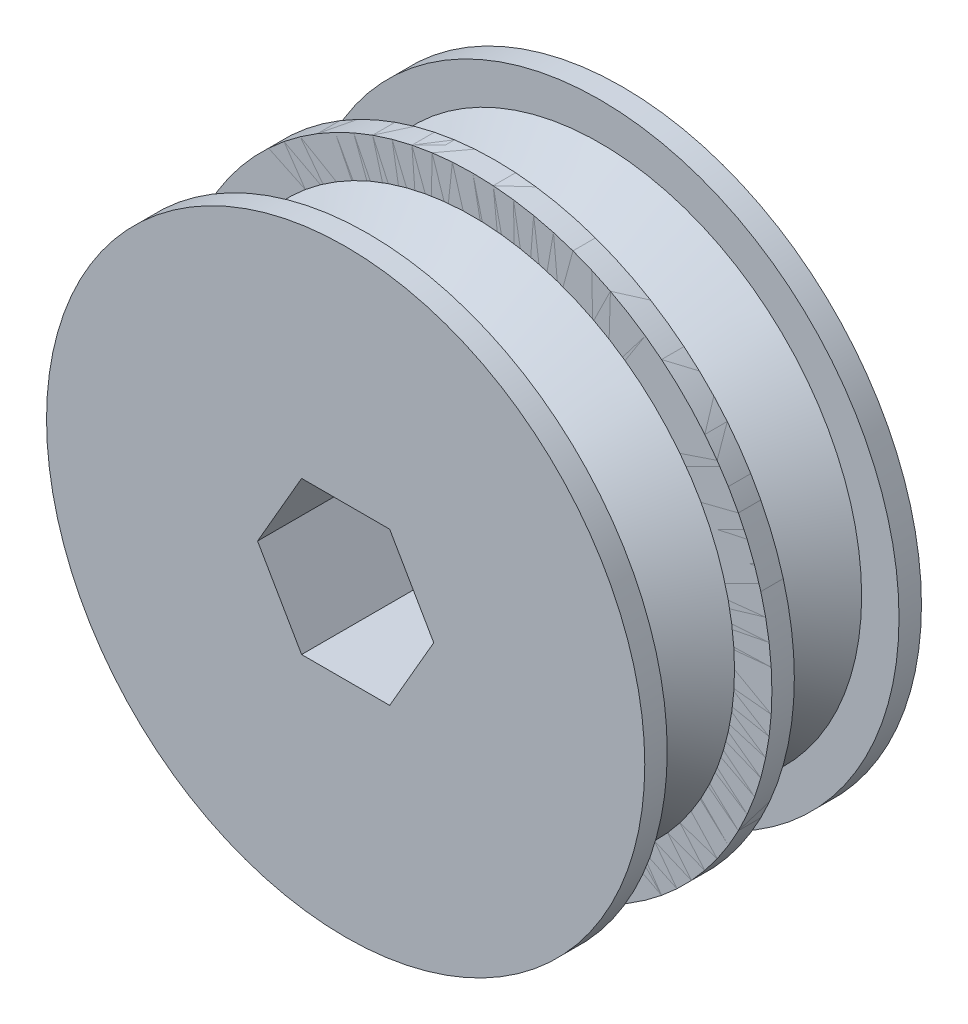
ISO-10303-21;
HEADER;
FILE_DESCRIPTION(('STEP AP214'),'2;1');
FILE_NAME('part.step','',(''),(''),'','','');
FILE_SCHEMA(('AUTOMOTIVE_DESIGN { 1 0 10303 214 1 1 1 1 }'));
ENDSEC;
DATA;
#1=APPLICATION_CONTEXT('core data for automotive mechanical design processes');
#2=APPLICATION_PROTOCOL_DEFINITION('international standard','automotive_design',2000,#1);
#3=PRODUCT_CONTEXT('',#1,'mechanical');
#4=PRODUCT('Part','Part','',(#3));
#5=PRODUCT_RELATED_PRODUCT_CATEGORY('part','',(#4));
#6=PRODUCT_DEFINITION_FORMATION('','',#4);
#7=PRODUCT_DEFINITION_CONTEXT('part definition',#1,'design');
#8=PRODUCT_DEFINITION('design','',#6,#7);
#9=PRODUCT_DEFINITION_SHAPE('','',#8);
#10=(LENGTH_UNIT() NAMED_UNIT(*) SI_UNIT(.MILLI.,.METRE.));
#11=(NAMED_UNIT(*) PLANE_ANGLE_UNIT() SI_UNIT($,.RADIAN.));
#12=(NAMED_UNIT(*) SI_UNIT($,.STERADIAN.) SOLID_ANGLE_UNIT());
#13=UNCERTAINTY_MEASURE_WITH_UNIT(LENGTH_MEASURE(1.E-05),#10,'distance_accuracy_value','');
#14=(GEOMETRIC_REPRESENTATION_CONTEXT(3) GLOBAL_UNCERTAINTY_ASSIGNED_CONTEXT((#13)) GLOBAL_UNIT_ASSIGNED_CONTEXT((#10,
#11,#12)) REPRESENTATION_CONTEXT('',''));
#15=CARTESIAN_POINT('',(0.,0.,0.));
#16=DIRECTION('',(0.,0.,1.));
#17=DIRECTION('',(1.,0.,0.));
#18=AXIS2_PLACEMENT_3D('',#15,#16,#17);
#19=CARTESIAN_POINT('',(0.,0.,6.35));
#20=DIRECTION('',(0.,0.,-1.));
#21=DIRECTION('',(-1.,0.,0.));
#22=AXIS2_PLACEMENT_3D('',#19,#20,#21);
#23=CYLINDRICAL_SURFACE('',#22,25.4);
#24=CARTESIAN_POINT('',(0.,0.,6.35));
#25=DIRECTION('',(0.,0.,1.));
#26=DIRECTION('',(1.,0.,0.));
#27=AXIS2_PLACEMENT_3D('',#24,#25,#26);
#28=CIRCLE('',#27,25.4);
#29=CARTESIAN_POINT('',(25.4,0.,6.35));
#30=VERTEX_POINT('',#29);
#31=EDGE_CURVE('P0_E11',#30,#30,#28,.T.);
#32=ORIENTED_EDGE('',*,*,#31,.F.);
#33=EDGE_LOOP('',(#32));
#34=FACE_BOUND('',#33,.T.);
#35=CARTESIAN_POINT('',(0.,0.,4.445));
#36=DIRECTION('',(0.,0.,1.));
#37=DIRECTION('',(1.,0.,0.));
#38=AXIS2_PLACEMENT_3D('',#35,#36,#37);
#39=CIRCLE('',#38,25.4);
#40=CARTESIAN_POINT('',(25.4,0.,4.445));
#41=VERTEX_POINT('',#40);
#42=EDGE_CURVE('P0_E126',#41,#41,#39,.T.);
#43=ORIENTED_EDGE('',*,*,#42,.T.);
#44=EDGE_LOOP('',(#43));
#45=FACE_BOUND('',#44,.T.);
#46=ADVANCED_FACE('P0_F16',(#34,#45),#23,.T.);
#47=CARTESIAN_POINT('',(0.,0.,6.35));
#48=DIRECTION('',(0.,0.,1.));
#49=DIRECTION('',(1.,0.,0.));
#50=AXIS2_PLACEMENT_3D('',#47,#48,#49);
#51=PLANE('',#50);
#52=DIRECTION('',(-0.499999999999998,0.86602540378444,0.));
#53=VECTOR('',#52,1.);
#54=CARTESIAN_POINT('',(-3.73949769354121,-6.477,6.35));
#55=LINE('',#54,#53);
#56=CARTESIAN_POINT('',(-3.73949769354121,-6.477,6.35));
#57=VERTEX_POINT('',#56);
#58=CARTESIAN_POINT('',(-7.4789953870824,0.,6.35));
#59=VERTEX_POINT('',#58);
#60=EDGE_CURVE('P0_E70',#57,#59,#55,.T.);
#61=ORIENTED_EDGE('',*,*,#60,.T.);
#62=DIRECTION('',(0.499999999999998,0.86602540378444,0.));
#63=VECTOR('',#62,1.);
#64=CARTESIAN_POINT('',(-7.4789953870824,0.,6.35));
#65=LINE('',#64,#63);
#66=CARTESIAN_POINT('',(-3.73949769354121,6.477,6.35));
#67=VERTEX_POINT('',#66);
#68=EDGE_CURVE('P0_E79',#59,#67,#65,.T.);
#69=ORIENTED_EDGE('',*,*,#68,.T.);
#70=DIRECTION('',(1.,0.,0.));
#71=VECTOR('',#70,1.);
#72=CARTESIAN_POINT('',(-3.73949769354122,6.477,6.35));
#73=LINE('',#72,#71);
#74=CARTESIAN_POINT('',(3.73949769354122,6.477,6.35));
#75=VERTEX_POINT('',#74);
#76=EDGE_CURVE('P0_E30',#67,#75,#73,.T.);
#77=ORIENTED_EDGE('',*,*,#76,.T.);
#78=DIRECTION('',(0.499999999999998,-0.86602540378444,0.));
#79=VECTOR('',#78,1.);
#80=CARTESIAN_POINT('',(3.73949769354122,6.477,6.35));
#81=LINE('',#80,#79);
#82=CARTESIAN_POINT('',(7.4789953870824,0.,6.35));
#83=VERTEX_POINT('',#82);
#84=EDGE_CURVE('P0_E94',#75,#83,#81,.T.);
#85=ORIENTED_EDGE('',*,*,#84,.T.);
#86=DIRECTION('',(-0.499999999999998,-0.86602540378444,0.));
#87=VECTOR('',#86,1.);
#88=CARTESIAN_POINT('',(7.4789953870824,0.,6.35));
#89=LINE('',#88,#87);
#90=CARTESIAN_POINT('',(3.73949769354122,-6.477,6.35));
#91=VERTEX_POINT('',#90);
#92=EDGE_CURVE('P0_E97',#83,#91,#89,.T.);
#93=ORIENTED_EDGE('',*,*,#92,.T.);
#94=DIRECTION('',(-1.,0.,0.));
#95=VECTOR('',#94,1.);
#96=CARTESIAN_POINT('',(3.73949769354122,-6.477,6.35));
#97=LINE('',#96,#95);
#98=EDGE_CURVE('P0_E76',#91,#57,#97,.T.);
#99=ORIENTED_EDGE('',*,*,#98,.T.);
#100=EDGE_LOOP('',(#61,#69,#77,#85,#93,#99));
#101=FACE_BOUND('',#100,.T.);
#102=ORIENTED_EDGE('',*,*,#31,.T.);
#103=EDGE_LOOP('',(#102));
#104=FACE_BOUND('',#103,.T.);
#105=ADVANCED_FACE('P0_F83',(#101,#104),#51,.T.);
#106=CARTESIAN_POINT('',(0.,0.,0.));
#107=DIRECTION('',(0.,0.,-1.));
#108=DIRECTION('',(-1.,0.,0.));
#109=AXIS2_PLACEMENT_3D('',#106,#107,#108);
#110=CONICAL_SURFACE('',#109,17.78,0.785398163397449);
#111=CARTESIAN_POINT('',(0.,0.,-4.445));
#112=DIRECTION('',(0.,0.,1.));
#113=DIRECTION('',(1.,0.,0.));
#114=AXIS2_PLACEMENT_3D('',#111,#112,#113);
#115=CIRCLE('',#114,22.225);
#116=CARTESIAN_POINT('',(22.225,0.,-4.445));
#117=VERTEX_POINT('',#116);
#118=EDGE_CURVE('P0_E113',#117,#117,#115,.T.);
#119=ORIENTED_EDGE('',*,*,#118,.T.);
#120=EDGE_LOOP('',(#119));
#121=FACE_BOUND('',#120,.T.);
#122=CARTESIAN_POINT('',(0.,0.,0.));
#123=DIRECTION('',(0.,0.,1.));
#124=DIRECTION('',(1.,0.,0.));
#125=AXIS2_PLACEMENT_3D('',#122,#123,#124);
#126=CIRCLE('',#125,17.78);
#127=CARTESIAN_POINT('',(17.78,0.,0.));
#128=VERTEX_POINT('',#127);
#129=EDGE_CURVE('P0_E132',#128,#128,#126,.T.);
#130=ORIENTED_EDGE('',*,*,#129,.F.);
#131=EDGE_LOOP('',(#130));
#132=FACE_BOUND('',#131,.T.);
#133=ADVANCED_FACE('P0_F160',(#121,#132),#110,.T.);
#134=CARTESIAN_POINT('',(0.,0.,4.445));
#135=DIRECTION('',(0.,0.,1.));
#136=DIRECTION('',(1.,0.,0.));
#137=AXIS2_PLACEMENT_3D('',#134,#135,#136);
#138=CONICAL_SURFACE('',#137,22.225,0.785398163397449);
#139=ORIENTED_EDGE('',*,*,#129,.T.);
#140=EDGE_LOOP('',(#139));
#141=FACE_BOUND('',#140,.T.);
#142=CARTESIAN_POINT('',(0.,0.,4.445));
#143=DIRECTION('',(0.,0.,1.));
#144=DIRECTION('',(1.,0.,0.));
#145=AXIS2_PLACEMENT_3D('',#142,#143,#144);
#146=CIRCLE('',#145,22.225);
#147=CARTESIAN_POINT('',(22.225,0.,4.445));
#148=VERTEX_POINT('',#147);
#149=EDGE_CURVE('P0_E129',#148,#148,#146,.T.);
#150=ORIENTED_EDGE('',*,*,#149,.F.);
#151=EDGE_LOOP('',(#150));
#152=FACE_BOUND('',#151,.T.);
#153=ADVANCED_FACE('P0_F166',(#141,#152),#138,.T.);
#154=CARTESIAN_POINT('',(-22.225,0.,4.445));
#155=DIRECTION('',(0.,0.,-1.));
#156=DIRECTION('',(-1.,0.,0.));
#157=AXIS2_PLACEMENT_3D('',#154,#155,#156);
#158=PLANE('',#157);
#159=ORIENTED_EDGE('',*,*,#149,.T.);
#160=EDGE_LOOP('',(#159));
#161=FACE_BOUND('',#160,.T.);
#162=ORIENTED_EDGE('',*,*,#42,.F.);
#163=EDGE_LOOP('',(#162));
#164=FACE_BOUND('',#163,.T.);
#165=ADVANCED_FACE('P0_F151',(#161,#164),#158,.T.);
#166=CARTESIAN_POINT('',(-22.225,0.,-4.445));
#167=DIRECTION('',(0.,0.,1.));
#168=DIRECTION('',(1.,0.,0.));
#169=AXIS2_PLACEMENT_3D('',#166,#167,#168);
#170=PLANE('',#169);
#171=CARTESIAN_POINT('',(0.,0.,-4.445));
#172=DIRECTION('',(0.,0.,1.));
#173=DIRECTION('',(1.,0.,0.));
#174=AXIS2_PLACEMENT_3D('',#171,#172,#173);
#175=CIRCLE('',#174,25.4);
#176=CARTESIAN_POINT('',(25.4,0.,-4.445));
#177=VERTEX_POINT('',#176);
#178=EDGE_CURVE('P0_E123',#177,#177,#175,.T.);
#179=ORIENTED_EDGE('',*,*,#178,.T.);
#180=EDGE_LOOP('',(#179));
#181=FACE_BOUND('',#180,.T.);
#182=ORIENTED_EDGE('',*,*,#118,.F.);
#183=EDGE_LOOP('',(#182));
#184=FACE_BOUND('',#183,.T.);
#185=ADVANCED_FACE('P0_F144',(#181,#184),#170,.T.);
#186=CARTESIAN_POINT('',(0.,0.,-6.35));
#187=DIRECTION('',(0.,0.,1.));
#188=DIRECTION('',(1.,0.,0.));
#189=AXIS2_PLACEMENT_3D('',#186,#187,#188);
#190=PLANE('',#189);
#191=DIRECTION('',(0.499999999999998,0.86602540378444,0.));
#192=VECTOR('',#191,1.);
#193=CARTESIAN_POINT('',(-7.4789953870824,0.,-6.35));
#194=LINE('',#193,#192);
#195=CARTESIAN_POINT('',(-7.4789953870824,0.,-6.35));
#196=VERTEX_POINT('',#195);
#197=CARTESIAN_POINT('',(-3.73949769354122,6.477,-6.35));
#198=VERTEX_POINT('',#197);
#199=EDGE_CURVE('P0_E101',#196,#198,#194,.T.);
#200=ORIENTED_EDGE('',*,*,#199,.F.);
#201=DIRECTION('',(-0.499999999999998,0.86602540378444,0.));
#202=VECTOR('',#201,1.);
#203=CARTESIAN_POINT('',(-3.73949769354121,-6.477,-6.35));
#204=LINE('',#203,#202);
#205=CARTESIAN_POINT('',(-3.73949769354121,-6.477,-6.35));
#206=VERTEX_POINT('',#205);
#207=EDGE_CURVE('P0_E38',#206,#196,#204,.T.);
#208=ORIENTED_EDGE('',*,*,#207,.F.);
#209=DIRECTION('',(-1.,0.,0.));
#210=VECTOR('',#209,1.);
#211=CARTESIAN_POINT('',(3.73949769354122,-6.477,-6.35));
#212=LINE('',#211,#210);
#213=CARTESIAN_POINT('',(3.73949769354122,-6.477,-6.35));
#214=VERTEX_POINT('',#213);
#215=EDGE_CURVE('P0_E87',#214,#206,#212,.T.);
#216=ORIENTED_EDGE('',*,*,#215,.F.);
#217=DIRECTION('',(-0.499999999999998,-0.86602540378444,0.));
#218=VECTOR('',#217,1.);
#219=CARTESIAN_POINT('',(7.4789953870824,0.,-6.35));
#220=LINE('',#219,#218);
#221=CARTESIAN_POINT('',(7.4789953870824,0.,-6.35));
#222=VERTEX_POINT('',#221);
#223=EDGE_CURVE('P0_E90',#222,#214,#220,.T.);
#224=ORIENTED_EDGE('',*,*,#223,.F.);
#225=DIRECTION('',(0.499999999999998,-0.86602540378444,0.));
#226=VECTOR('',#225,1.);
#227=CARTESIAN_POINT('',(3.73949769354122,6.477,-6.35));
#228=LINE('',#227,#226);
#229=CARTESIAN_POINT('',(3.73949769354122,6.477,-6.35));
#230=VERTEX_POINT('',#229);
#231=EDGE_CURVE('P0_E106',#230,#222,#228,.T.);
#232=ORIENTED_EDGE('',*,*,#231,.F.);
#233=DIRECTION('',(1.,0.,0.));
#234=VECTOR('',#233,1.);
#235=CARTESIAN_POINT('',(-3.73949769354122,6.477,-6.35));
#236=LINE('',#235,#234);
#237=EDGE_CURVE('P0_E103',#198,#230,#236,.T.);
#238=ORIENTED_EDGE('',*,*,#237,.F.);
#239=EDGE_LOOP('',(#200,#208,#216,#224,#232,#238));
#240=FACE_BOUND('',#239,.T.);
#241=CARTESIAN_POINT('',(0.,0.,-6.35));
#242=DIRECTION('',(0.,0.,1.));
#243=DIRECTION('',(1.,0.,0.));
#244=AXIS2_PLACEMENT_3D('',#241,#242,#243);
#245=CIRCLE('',#244,25.4);
#246=CARTESIAN_POINT('',(25.4,0.,-6.35));
#247=VERTEX_POINT('',#246);
#248=EDGE_CURVE('P0_E19',#247,#247,#245,.T.);
#249=ORIENTED_EDGE('',*,*,#248,.F.);
#250=EDGE_LOOP('',(#249));
#251=FACE_BOUND('',#250,.T.);
#252=ADVANCED_FACE('P0_F142',(#240,#251),#190,.F.);
#253=ORIENTED_EDGE('',*,*,#248,.T.);
#254=EDGE_LOOP('',(#253));
#255=FACE_BOUND('',#254,.T.);
#256=ORIENTED_EDGE('',*,*,#178,.F.);
#257=EDGE_LOOP('',(#256));
#258=FACE_BOUND('',#257,.T.);
#259=ADVANCED_FACE('P0_F139',(#255,#258),#23,.T.);
#260=CARTESIAN_POINT('',(-3.73949769354121,-6.477,6.35));
#261=DIRECTION('',(-0.86602540378444,-0.499999999999998,0.));
#262=DIRECTION('',(0.499999999999998,-0.86602540378444,0.));
#263=AXIS2_PLACEMENT_3D('',#260,#261,#262);
#264=PLANE('',#263);
#265=ORIENTED_EDGE('',*,*,#207,.T.);
#266=DIRECTION('',(0.,0.,-1.));
#267=VECTOR('',#266,1.);
#268=CARTESIAN_POINT('',(-7.4789953870824,0.,6.35));
#269=LINE('',#268,#267);
#270=EDGE_CURVE('P0_E66',#59,#196,#269,.T.);
#271=ORIENTED_EDGE('',*,*,#270,.F.);
#272=ORIENTED_EDGE('',*,*,#60,.F.);
#273=DIRECTION('',(0.,0.,-1.));
#274=VECTOR('',#273,1.);
#275=CARTESIAN_POINT('',(-3.73949769354121,-6.477,6.35));
#276=LINE('',#275,#274);
#277=EDGE_CURVE('P0_E111',#57,#206,#276,.T.);
#278=ORIENTED_EDGE('',*,*,#277,.T.);
#279=EDGE_LOOP('',(#265,#271,#272,#278));
#280=FACE_BOUND('',#279,.T.);
#281=ADVANCED_FACE('P0_F68',(#280),#264,.F.);
#282=CARTESIAN_POINT('',(3.73949769354122,-6.477,6.35));
#283=DIRECTION('',(0.,-1.,0.));
#284=DIRECTION('',(0.,0.,-1.));
#285=AXIS2_PLACEMENT_3D('',#282,#283,#284);
#286=PLANE('',#285);
#287=ORIENTED_EDGE('',*,*,#215,.T.);
#288=ORIENTED_EDGE('',*,*,#277,.F.);
#289=ORIENTED_EDGE('',*,*,#98,.F.);
#290=DIRECTION('',(0.,0.,-1.));
#291=VECTOR('',#290,1.);
#292=CARTESIAN_POINT('',(3.73949769354122,-6.477,6.35));
#293=LINE('',#292,#291);
#294=EDGE_CURVE('P0_E114',#91,#214,#293,.T.);
#295=ORIENTED_EDGE('',*,*,#294,.T.);
#296=EDGE_LOOP('',(#287,#288,#289,#295));
#297=FACE_BOUND('',#296,.T.);
#298=ADVANCED_FACE('P0_F226',(#297),#286,.F.);
#299=CARTESIAN_POINT('',(7.4789953870824,0.,6.35));
#300=DIRECTION('',(0.86602540378444,-0.499999999999998,0.));
#301=DIRECTION('',(0.499999999999998,0.86602540378444,0.));
#302=AXIS2_PLACEMENT_3D('',#299,#300,#301);
#303=PLANE('',#302);
#304=ORIENTED_EDGE('',*,*,#223,.T.);
#305=ORIENTED_EDGE('',*,*,#294,.F.);
#306=ORIENTED_EDGE('',*,*,#92,.F.);
#307=DIRECTION('',(0.,0.,-1.));
#308=VECTOR('',#307,1.);
#309=CARTESIAN_POINT('',(7.4789953870824,0.,6.35));
#310=LINE('',#309,#308);
#311=EDGE_CURVE('P0_E116',#83,#222,#310,.T.);
#312=ORIENTED_EDGE('',*,*,#311,.T.);
#313=EDGE_LOOP('',(#304,#305,#306,#312));
#314=FACE_BOUND('',#313,.T.);
#315=ADVANCED_FACE('P0_F234',(#314),#303,.F.);
#316=CARTESIAN_POINT('',(3.73949769354122,6.477,6.35));
#317=DIRECTION('',(0.86602540378444,0.499999999999998,0.));
#318=DIRECTION('',(-0.499999999999998,0.86602540378444,0.));
#319=AXIS2_PLACEMENT_3D('',#316,#317,#318);
#320=PLANE('',#319);
#321=ORIENTED_EDGE('',*,*,#231,.T.);
#322=ORIENTED_EDGE('',*,*,#311,.F.);
#323=ORIENTED_EDGE('',*,*,#84,.F.);
#324=DIRECTION('',(0.,0.,-1.));
#325=VECTOR('',#324,1.);
#326=CARTESIAN_POINT('',(3.73949769354122,6.477,6.35));
#327=LINE('',#326,#325);
#328=EDGE_CURVE('P0_E118',#75,#230,#327,.T.);
#329=ORIENTED_EDGE('',*,*,#328,.T.);
#330=EDGE_LOOP('',(#321,#322,#323,#329));
#331=FACE_BOUND('',#330,.T.);
#332=ADVANCED_FACE('P0_F244',(#331),#320,.F.);
#333=CARTESIAN_POINT('',(-3.73949769354122,6.477,6.35));
#334=DIRECTION('',(0.,1.,0.));
#335=DIRECTION('',(0.,0.,1.));
#336=AXIS2_PLACEMENT_3D('',#333,#334,#335);
#337=PLANE('',#336);
#338=ORIENTED_EDGE('',*,*,#237,.T.);
#339=ORIENTED_EDGE('',*,*,#328,.F.);
#340=ORIENTED_EDGE('',*,*,#76,.F.);
#341=DIRECTION('',(0.,0.,-1.));
#342=VECTOR('',#341,1.);
#343=CARTESIAN_POINT('',(-3.73949769354122,6.477,6.35));
#344=LINE('',#343,#342);
#345=EDGE_CURVE('P0_E75',#67,#198,#344,.T.);
#346=ORIENTED_EDGE('',*,*,#345,.T.);
#347=EDGE_LOOP('',(#338,#339,#340,#346));
#348=FACE_BOUND('',#347,.T.);
#349=ADVANCED_FACE('P0_F254',(#348),#337,.F.);
#350=CARTESIAN_POINT('',(-7.4789953870824,0.,6.35));
#351=DIRECTION('',(-0.86602540378444,0.499999999999998,0.));
#352=DIRECTION('',(-0.499999999999998,-0.86602540378444,0.));
#353=AXIS2_PLACEMENT_3D('',#350,#351,#352);
#354=PLANE('',#353);
#355=ORIENTED_EDGE('',*,*,#199,.T.);
#356=ORIENTED_EDGE('',*,*,#345,.F.);
#357=ORIENTED_EDGE('',*,*,#68,.F.);
#358=ORIENTED_EDGE('',*,*,#270,.T.);
#359=EDGE_LOOP('',(#355,#356,#357,#358));
#360=FACE_BOUND('',#359,.T.);
#361=ADVANCED_FACE('P0_F80',(#360),#354,.F.);
#362=CLOSED_SHELL('',(#46,#105,#133,#153,#165,#185,#252,#259,#281,#298,#315,#332,#349,#361));
#363=MANIFOLD_SOLID_BREP('P0_B1',#362);
#364=CARTESIAN_POINT('',(0.,0.,17.145));
#365=DIRECTION('',(0.,0.,-1.));
#366=DIRECTION('',(-1.,0.,0.));
#367=AXIS2_PLACEMENT_3D('',#364,#365,#366);
#368=CYLINDRICAL_SURFACE('',#367,25.4);
#369=CARTESIAN_POINT('',(0.,0.,17.145));
#370=DIRECTION('',(0.,0.,1.));
#371=DIRECTION('',(1.,0.,0.));
#372=AXIS2_PLACEMENT_3D('',#369,#370,#371);
#373=CIRCLE('',#372,25.4);
#374=CARTESIAN_POINT('',(25.4,0.,17.145));
#375=VERTEX_POINT('',#374);
#376=EDGE_CURVE('P1_E10',#375,#375,#373,.T.);
#377=ORIENTED_EDGE('',*,*,#376,.F.);
#378=EDGE_LOOP('',(#377));
#379=FACE_BOUND('',#378,.T.);
#380=CARTESIAN_POINT('',(0.,0.,15.24));
#381=DIRECTION('',(0.,0.,1.));
#382=DIRECTION('',(1.,0.,0.));
#383=AXIS2_PLACEMENT_3D('',#380,#381,#382);
#384=CIRCLE('',#383,25.4);
#385=CARTESIAN_POINT('',(25.4,0.,15.24));
#386=VERTEX_POINT('',#385);
#387=EDGE_CURVE('P1_E125',#386,#386,#384,.T.);
#388=ORIENTED_EDGE('',*,*,#387,.T.);
#389=EDGE_LOOP('',(#388));
#390=FACE_BOUND('',#389,.T.);
#391=ADVANCED_FACE('P1_F15',(#379,#390),#368,.T.);
#392=CARTESIAN_POINT('',(0.,0.,17.145));
#393=DIRECTION('',(0.,0.,1.));
#394=DIRECTION('',(1.,0.,0.));
#395=AXIS2_PLACEMENT_3D('',#392,#393,#394);
#396=PLANE('',#395);
#397=DIRECTION('',(-0.499999999999998,0.86602540378444,0.));
#398=VECTOR('',#397,1.);
#399=CARTESIAN_POINT('',(-3.73949769354121,-6.477,17.145));
#400=LINE('',#399,#398);
#401=CARTESIAN_POINT('',(-3.73949769354121,-6.477,17.145));
#402=VERTEX_POINT('',#401);
#403=CARTESIAN_POINT('',(-7.4789953870824,0.,17.145));
#404=VERTEX_POINT('',#403);
#405=EDGE_CURVE('P1_E69',#402,#404,#400,.T.);
#406=ORIENTED_EDGE('',*,*,#405,.T.);
#407=DIRECTION('',(0.499999999999998,0.86602540378444,0.));
#408=VECTOR('',#407,1.);
#409=CARTESIAN_POINT('',(-7.4789953870824,0.,17.145));
#410=LINE('',#409,#408);
#411=CARTESIAN_POINT('',(-3.73949769354121,6.477,17.145));
#412=VERTEX_POINT('',#411);
#413=EDGE_CURVE('P1_E78',#404,#412,#410,.T.);
#414=ORIENTED_EDGE('',*,*,#413,.T.);
#415=DIRECTION('',(1.,0.,0.));
#416=VECTOR('',#415,1.);
#417=CARTESIAN_POINT('',(-3.73949769354122,6.477,17.145));
#418=LINE('',#417,#416);
#419=CARTESIAN_POINT('',(3.73949769354122,6.477,17.145));
#420=VERTEX_POINT('',#419);
#421=EDGE_CURVE('P1_E29',#412,#420,#418,.T.);
#422=ORIENTED_EDGE('',*,*,#421,.T.);
#423=DIRECTION('',(0.499999999999998,-0.86602540378444,0.));
#424=VECTOR('',#423,1.);
#425=CARTESIAN_POINT('',(3.73949769354122,6.477,17.145));
#426=LINE('',#425,#424);
#427=CARTESIAN_POINT('',(7.4789953870824,0.,17.145));
#428=VERTEX_POINT('',#427);
#429=EDGE_CURVE('P1_E93',#420,#428,#426,.T.);
#430=ORIENTED_EDGE('',*,*,#429,.T.);
#431=DIRECTION('',(-0.499999999999998,-0.86602540378444,0.));
#432=VECTOR('',#431,1.);
#433=CARTESIAN_POINT('',(7.4789953870824,0.,17.145));
#434=LINE('',#433,#432);
#435=CARTESIAN_POINT('',(3.73949769354122,-6.477,17.145));
#436=VERTEX_POINT('',#435);
#437=EDGE_CURVE('P1_E96',#428,#436,#434,.T.);
#438=ORIENTED_EDGE('',*,*,#437,.T.);
#439=DIRECTION('',(-1.,0.,0.));
#440=VECTOR('',#439,1.);
#441=CARTESIAN_POINT('',(3.73949769354122,-6.477,17.145));
#442=LINE('',#441,#440);
#443=EDGE_CURVE('P1_E75',#436,#402,#442,.T.);
#444=ORIENTED_EDGE('',*,*,#443,.T.);
#445=EDGE_LOOP('',(#406,#414,#422,#430,#438,#444));
#446=FACE_BOUND('',#445,.T.);
#447=ORIENTED_EDGE('',*,*,#376,.T.);
#448=EDGE_LOOP('',(#447));
#449=FACE_BOUND('',#448,.T.);
#450=ADVANCED_FACE('P1_F82',(#446,#449),#396,.T.);
#451=CARTESIAN_POINT('',(0.,0.,10.795));
#452=DIRECTION('',(0.,0.,-1.));
#453=DIRECTION('',(-1.,0.,0.));
#454=AXIS2_PLACEMENT_3D('',#451,#452,#453);
#455=CONICAL_SURFACE('',#454,17.78,0.785398163397449);
#456=CARTESIAN_POINT('',(0.,0.,6.35));
#457=DIRECTION('',(0.,0.,1.));
#458=DIRECTION('',(1.,0.,0.));
#459=AXIS2_PLACEMENT_3D('',#456,#457,#458);
#460=CIRCLE('',#459,22.225);
#461=CARTESIAN_POINT('',(22.225,0.,6.35));
#462=VERTEX_POINT('',#461);
#463=EDGE_CURVE('P1_E112',#462,#462,#460,.T.);
#464=ORIENTED_EDGE('',*,*,#463,.T.);
#465=EDGE_LOOP('',(#464));
#466=FACE_BOUND('',#465,.T.);
#467=CARTESIAN_POINT('',(0.,0.,10.795));
#468=DIRECTION('',(0.,0.,1.));
#469=DIRECTION('',(1.,0.,0.));
#470=AXIS2_PLACEMENT_3D('',#467,#468,#469);
#471=CIRCLE('',#470,17.78);
#472=CARTESIAN_POINT('',(17.78,0.,10.795));
#473=VERTEX_POINT('',#472);
#474=EDGE_CURVE('P1_E131',#473,#473,#471,.T.);
#475=ORIENTED_EDGE('',*,*,#474,.F.);
#476=EDGE_LOOP('',(#475));
#477=FACE_BOUND('',#476,.T.);
#478=ADVANCED_FACE('P1_F159',(#466,#477),#455,.T.);
#479=CARTESIAN_POINT('',(0.,0.,15.24));
#480=DIRECTION('',(0.,0.,1.));
#481=DIRECTION('',(1.,0.,0.));
#482=AXIS2_PLACEMENT_3D('',#479,#480,#481);
#483=CONICAL_SURFACE('',#482,22.225,0.785398163397449);
#484=ORIENTED_EDGE('',*,*,#474,.T.);
#485=EDGE_LOOP('',(#484));
#486=FACE_BOUND('',#485,.T.);
#487=CARTESIAN_POINT('',(0.,0.,15.24));
#488=DIRECTION('',(0.,0.,1.));
#489=DIRECTION('',(1.,0.,0.));
#490=AXIS2_PLACEMENT_3D('',#487,#488,#489);
#491=CIRCLE('',#490,22.225);
#492=CARTESIAN_POINT('',(22.225,0.,15.24));
#493=VERTEX_POINT('',#492);
#494=EDGE_CURVE('P1_E128',#493,#493,#491,.T.);
#495=ORIENTED_EDGE('',*,*,#494,.F.);
#496=EDGE_LOOP('',(#495));
#497=FACE_BOUND('',#496,.T.);
#498=ADVANCED_FACE('P1_F165',(#486,#497),#483,.T.);
#499=CARTESIAN_POINT('',(-22.225,0.,15.24));
#500=DIRECTION('',(0.,0.,-1.));
#501=DIRECTION('',(-1.,0.,0.));
#502=AXIS2_PLACEMENT_3D('',#499,#500,#501);
#503=PLANE('',#502);
#504=ORIENTED_EDGE('',*,*,#494,.T.);
#505=EDGE_LOOP('',(#504));
#506=FACE_BOUND('',#505,.T.);
#507=ORIENTED_EDGE('',*,*,#387,.F.);
#508=EDGE_LOOP('',(#507));
#509=FACE_BOUND('',#508,.T.);
#510=ADVANCED_FACE('P1_F150',(#506,#509),#503,.T.);
#511=CARTESIAN_POINT('',(-22.225,0.,6.35));
#512=DIRECTION('',(0.,0.,1.));
#513=DIRECTION('',(1.,0.,0.));
#514=AXIS2_PLACEMENT_3D('',#511,#512,#513);
#515=PLANE('',#514);
#516=CARTESIAN_POINT('',(0.,0.,6.35));
#517=DIRECTION('',(0.,0.,1.));
#518=DIRECTION('',(1.,0.,0.));
#519=AXIS2_PLACEMENT_3D('',#516,#517,#518);
#520=CIRCLE('',#519,25.4);
#521=CARTESIAN_POINT('',(25.4,0.,6.35));
#522=VERTEX_POINT('',#521);
#523=EDGE_CURVE('P1_E122',#522,#522,#520,.T.);
#524=ORIENTED_EDGE('',*,*,#523,.T.);
#525=EDGE_LOOP('',(#524));
#526=FACE_BOUND('',#525,.T.);
#527=ORIENTED_EDGE('',*,*,#463,.F.);
#528=EDGE_LOOP('',(#527));
#529=FACE_BOUND('',#528,.T.);
#530=ADVANCED_FACE('P1_F143',(#526,#529),#515,.T.);
#531=CARTESIAN_POINT('',(0.,0.,4.445));
#532=DIRECTION('',(0.,0.,1.));
#533=DIRECTION('',(1.,0.,0.));
#534=AXIS2_PLACEMENT_3D('',#531,#532,#533);
#535=PLANE('',#534);
#536=DIRECTION('',(0.499999999999998,0.86602540378444,0.));
#537=VECTOR('',#536,1.);
#538=CARTESIAN_POINT('',(-7.4789953870824,0.,4.445));
#539=LINE('',#538,#537);
#540=CARTESIAN_POINT('',(-7.4789953870824,0.,4.445));
#541=VERTEX_POINT('',#540);
#542=CARTESIAN_POINT('',(-3.73949769354122,6.477,4.445));
#543=VERTEX_POINT('',#542);
#544=EDGE_CURVE('P1_E100',#541,#543,#539,.T.);
#545=ORIENTED_EDGE('',*,*,#544,.F.);
#546=DIRECTION('',(-0.499999999999998,0.86602540378444,0.));
#547=VECTOR('',#546,1.);
#548=CARTESIAN_POINT('',(-3.73949769354121,-6.477,4.445));
#549=LINE('',#548,#547);
#550=CARTESIAN_POINT('',(-3.73949769354121,-6.477,4.445));
#551=VERTEX_POINT('',#550);
#552=EDGE_CURVE('P1_E37',#551,#541,#549,.T.);
#553=ORIENTED_EDGE('',*,*,#552,.F.);
#554=DIRECTION('',(-1.,0.,0.));
#555=VECTOR('',#554,1.);
#556=CARTESIAN_POINT('',(3.73949769354122,-6.477,4.445));
#557=LINE('',#556,#555);
#558=CARTESIAN_POINT('',(3.73949769354122,-6.477,4.445));
#559=VERTEX_POINT('',#558);
#560=EDGE_CURVE('P1_E86',#559,#551,#557,.T.);
#561=ORIENTED_EDGE('',*,*,#560,.F.);
#562=DIRECTION('',(-0.499999999999998,-0.86602540378444,0.));
#563=VECTOR('',#562,1.);
#564=CARTESIAN_POINT('',(7.4789953870824,0.,4.445));
#565=LINE('',#564,#563);
#566=CARTESIAN_POINT('',(7.4789953870824,0.,4.445));
#567=VERTEX_POINT('',#566);
#568=EDGE_CURVE('P1_E89',#567,#559,#565,.T.);
#569=ORIENTED_EDGE('',*,*,#568,.F.);
#570=DIRECTION('',(0.499999999999998,-0.86602540378444,0.));
#571=VECTOR('',#570,1.);
#572=CARTESIAN_POINT('',(3.73949769354122,6.477,4.445));
#573=LINE('',#572,#571);
#574=CARTESIAN_POINT('',(3.73949769354122,6.477,4.445));
#575=VERTEX_POINT('',#574);
#576=EDGE_CURVE('P1_E105',#575,#567,#573,.T.);
#577=ORIENTED_EDGE('',*,*,#576,.F.);
#578=DIRECTION('',(1.,0.,0.));
#579=VECTOR('',#578,1.);
#580=CARTESIAN_POINT('',(-3.73949769354122,6.477,4.445));
#581=LINE('',#580,#579);
#582=EDGE_CURVE('P1_E102',#543,#575,#581,.T.);
#583=ORIENTED_EDGE('',*,*,#582,.F.);
#584=EDGE_LOOP('',(#545,#553,#561,#569,#577,#583));
#585=FACE_BOUND('',#584,.T.);
#586=CARTESIAN_POINT('',(0.,0.,4.445));
#587=DIRECTION('',(0.,0.,1.));
#588=DIRECTION('',(1.,0.,0.));
#589=AXIS2_PLACEMENT_3D('',#586,#587,#588);
#590=CIRCLE('',#589,25.4);
#591=CARTESIAN_POINT('',(25.4,0.,4.445));
#592=VERTEX_POINT('',#591);
#593=EDGE_CURVE('P1_E18',#592,#592,#590,.T.);
#594=ORIENTED_EDGE('',*,*,#593,.F.);
#595=EDGE_LOOP('',(#594));
#596=FACE_BOUND('',#595,.T.);
#597=ADVANCED_FACE('P1_F141',(#585,#596),#535,.F.);
#598=ORIENTED_EDGE('',*,*,#593,.T.);
#599=EDGE_LOOP('',(#598));
#600=FACE_BOUND('',#599,.T.);
#601=ORIENTED_EDGE('',*,*,#523,.F.);
#602=EDGE_LOOP('',(#601));
#603=FACE_BOUND('',#602,.T.);
#604=ADVANCED_FACE('P1_F138',(#600,#603),#368,.T.);
#605=CARTESIAN_POINT('',(-3.73949769354121,-6.477,17.145));
#606=DIRECTION('',(-0.86602540378444,-0.499999999999998,0.));
#607=DIRECTION('',(0.499999999999998,-0.86602540378444,0.));
#608=AXIS2_PLACEMENT_3D('',#605,#606,#607);
#609=PLANE('',#608);
#610=ORIENTED_EDGE('',*,*,#552,.T.);
#611=DIRECTION('',(0.,0.,-1.));
#612=VECTOR('',#611,1.);
#613=CARTESIAN_POINT('',(-7.4789953870824,0.,17.145));
#614=LINE('',#613,#612);
#615=EDGE_CURVE('P1_E65',#404,#541,#614,.T.);
#616=ORIENTED_EDGE('',*,*,#615,.F.);
#617=ORIENTED_EDGE('',*,*,#405,.F.);
#618=DIRECTION('',(0.,0.,-1.));
#619=VECTOR('',#618,1.);
#620=CARTESIAN_POINT('',(-3.73949769354121,-6.477,17.145));
#621=LINE('',#620,#619);
#622=EDGE_CURVE('P1_E110',#402,#551,#621,.T.);
#623=ORIENTED_EDGE('',*,*,#622,.T.);
#624=EDGE_LOOP('',(#610,#616,#617,#623));
#625=FACE_BOUND('',#624,.T.);
#626=ADVANCED_FACE('P1_F67',(#625),#609,.F.);
#627=CARTESIAN_POINT('',(3.73949769354122,-6.477,17.145));
#628=DIRECTION('',(0.,-1.,0.));
#629=DIRECTION('',(0.,0.,-1.));
#630=AXIS2_PLACEMENT_3D('',#627,#628,#629);
#631=PLANE('',#630);
#632=ORIENTED_EDGE('',*,*,#560,.T.);
#633=ORIENTED_EDGE('',*,*,#622,.F.);
#634=ORIENTED_EDGE('',*,*,#443,.F.);
#635=DIRECTION('',(0.,0.,-1.));
#636=VECTOR('',#635,1.);
#637=CARTESIAN_POINT('',(3.73949769354122,-6.477,17.145));
#638=LINE('',#637,#636);
#639=EDGE_CURVE('P1_E113',#436,#559,#638,.T.);
#640=ORIENTED_EDGE('',*,*,#639,.T.);
#641=EDGE_LOOP('',(#632,#633,#634,#640));
#642=FACE_BOUND('',#641,.T.);
#643=ADVANCED_FACE('P1_F221',(#642),#631,.F.);
#644=CARTESIAN_POINT('',(7.4789953870824,0.,17.145));
#645=DIRECTION('',(0.86602540378444,-0.499999999999998,0.));
#646=DIRECTION('',(0.499999999999998,0.86602540378444,0.));
#647=AXIS2_PLACEMENT_3D('',#644,#645,#646);
#648=PLANE('',#647);
#649=ORIENTED_EDGE('',*,*,#568,.T.);
#650=ORIENTED_EDGE('',*,*,#639,.F.);
#651=ORIENTED_EDGE('',*,*,#437,.F.);
#652=DIRECTION('',(0.,0.,-1.));
#653=VECTOR('',#652,1.);
#654=CARTESIAN_POINT('',(7.4789953870824,0.,17.145));
#655=LINE('',#654,#653);
#656=EDGE_CURVE('P1_E115',#428,#567,#655,.T.);
#657=ORIENTED_EDGE('',*,*,#656,.T.);
#658=EDGE_LOOP('',(#649,#650,#651,#657));
#659=FACE_BOUND('',#658,.T.);
#660=ADVANCED_FACE('P1_F229',(#659),#648,.F.);
#661=CARTESIAN_POINT('',(3.73949769354122,6.477,17.145));
#662=DIRECTION('',(0.86602540378444,0.499999999999998,0.));
#663=DIRECTION('',(-0.499999999999998,0.86602540378444,0.));
#664=AXIS2_PLACEMENT_3D('',#661,#662,#663);
#665=PLANE('',#664);
#666=ORIENTED_EDGE('',*,*,#576,.T.);
#667=ORIENTED_EDGE('',*,*,#656,.F.);
#668=ORIENTED_EDGE('',*,*,#429,.F.);
#669=DIRECTION('',(0.,0.,-1.));
#670=VECTOR('',#669,1.);
#671=CARTESIAN_POINT('',(3.73949769354122,6.477,17.145));
#672=LINE('',#671,#670);
#673=EDGE_CURVE('P1_E117',#420,#575,#672,.T.);
#674=ORIENTED_EDGE('',*,*,#673,.T.);
#675=EDGE_LOOP('',(#666,#667,#668,#674));
#676=FACE_BOUND('',#675,.T.);
#677=ADVANCED_FACE('P1_F239',(#676),#665,.F.);
#678=CARTESIAN_POINT('',(-3.73949769354122,6.477,17.145));
#679=DIRECTION('',(0.,1.,0.));
#680=DIRECTION('',(0.,0.,1.));
#681=AXIS2_PLACEMENT_3D('',#678,#679,#680);
#682=PLANE('',#681);
#683=ORIENTED_EDGE('',*,*,#582,.T.);
#684=ORIENTED_EDGE('',*,*,#673,.F.);
#685=ORIENTED_EDGE('',*,*,#421,.F.);
#686=DIRECTION('',(0.,0.,-1.));
#687=VECTOR('',#686,1.);
#688=CARTESIAN_POINT('',(-3.73949769354122,6.477,17.145));
#689=LINE('',#688,#687);
#690=EDGE_CURVE('P1_E74',#412,#543,#689,.T.);
#691=ORIENTED_EDGE('',*,*,#690,.T.);
#692=EDGE_LOOP('',(#683,#684,#685,#691));
#693=FACE_BOUND('',#692,.T.);
#694=ADVANCED_FACE('P1_F249',(#693),#682,.F.);
#695=CARTESIAN_POINT('',(-7.4789953870824,0.,17.145));
#696=DIRECTION('',(-0.86602540378444,0.499999999999998,0.));
#697=DIRECTION('',(-0.499999999999998,-0.86602540378444,0.));
#698=AXIS2_PLACEMENT_3D('',#695,#696,#697);
#699=PLANE('',#698);
#700=ORIENTED_EDGE('',*,*,#544,.T.);
#701=ORIENTED_EDGE('',*,*,#690,.F.);
#702=ORIENTED_EDGE('',*,*,#413,.F.);
#703=ORIENTED_EDGE('',*,*,#615,.T.);
#704=EDGE_LOOP('',(#700,#701,#702,#703));
#705=FACE_BOUND('',#704,.T.);
#706=ADVANCED_FACE('P1_F79',(#705),#699,.F.);
#707=CLOSED_SHELL('',(#391,#450,#478,#498,#510,#530,#597,#604,#626,#643,#660,#677,#694,#706));
#708=MANIFOLD_SOLID_BREP('P1_B1',#707);
#709=ADVANCED_BREP_SHAPE_REPRESENTATION('',(#18,#363,#708),#14);
#710=SHAPE_DEFINITION_REPRESENTATION(#9,#709);
ENDSEC;
END-ISO-10303-21;
